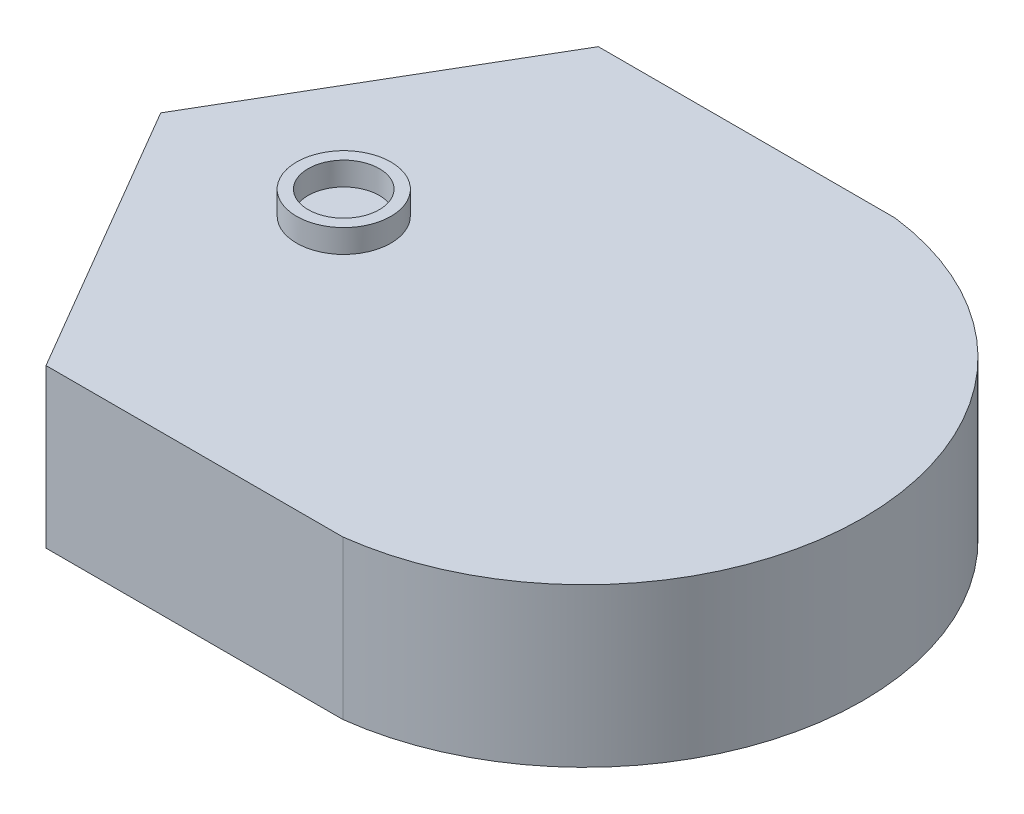
ISO-10303-21;
HEADER;
FILE_DESCRIPTION(('STEP AP214'),'2;1');
FILE_NAME('part.step','',(''),(''),'','','');
FILE_SCHEMA(('AUTOMOTIVE_DESIGN { 1 0 10303 214 1 1 1 1 }'));
ENDSEC;
DATA;
#1=APPLICATION_CONTEXT('core data for automotive mechanical design processes');
#2=APPLICATION_PROTOCOL_DEFINITION('international standard','automotive_design',2000,#1);
#3=PRODUCT_CONTEXT('',#1,'mechanical');
#4=PRODUCT('Part','Part','',(#3));
#5=PRODUCT_RELATED_PRODUCT_CATEGORY('part','',(#4));
#6=PRODUCT_DEFINITION_FORMATION('','',#4);
#7=PRODUCT_DEFINITION_CONTEXT('part definition',#1,'design');
#8=PRODUCT_DEFINITION('design','',#6,#7);
#9=PRODUCT_DEFINITION_SHAPE('','',#8);
#10=(LENGTH_UNIT() NAMED_UNIT(*) SI_UNIT(.MILLI.,.METRE.));
#11=(NAMED_UNIT(*) PLANE_ANGLE_UNIT() SI_UNIT($,.RADIAN.));
#12=(NAMED_UNIT(*) SI_UNIT($,.STERADIAN.) SOLID_ANGLE_UNIT());
#13=UNCERTAINTY_MEASURE_WITH_UNIT(LENGTH_MEASURE(1.E-05),#10,'distance_accuracy_value','');
#14=(GEOMETRIC_REPRESENTATION_CONTEXT(3) GLOBAL_UNCERTAINTY_ASSIGNED_CONTEXT((#13)) GLOBAL_UNIT_ASSIGNED_CONTEXT((#10,
#11,#12)) REPRESENTATION_CONTEXT('',''));
#15=CARTESIAN_POINT('',(0.,0.,0.));
#16=DIRECTION('',(0.,0.,1.));
#17=DIRECTION('',(1.,0.,0.));
#18=AXIS2_PLACEMENT_3D('',#15,#16,#17);
#19=CARTESIAN_POINT('',(21.1852030443668,-6.99999999999999,-3.31454578179853));
#20=DIRECTION('',(0.,1.,0.));
#21=DIRECTION('',(0.,0.,1.));
#22=AXIS2_PLACEMENT_3D('',#19,#20,#21);
#23=CYLINDRICAL_SURFACE('',#22,29.9186118428369);
#24=CARTESIAN_POINT('',(21.1852030443668,10.,-3.31454578179853));
#25=DIRECTION('',(0.,1.,0.));
#26=DIRECTION('',(0.,0.,-1.));
#27=AXIS2_PLACEMENT_3D('',#24,#25,#26);
#28=CIRCLE('',#27,29.9186118428369);
#29=CARTESIAN_POINT('',(24.8996786942298,10.,26.3725895675227));
#30=VERTEX_POINT('',#29);
#31=CARTESIAN_POINT('',(24.8996786942298,10.,-33.0016811311198));
#32=VERTEX_POINT('',#31);
#33=EDGE_CURVE('E122',#30,#32,#28,.T.);
#34=ORIENTED_EDGE('',*,*,#33,.F.);
#35=DIRECTION('',(0.,1.,0.));
#36=VECTOR('',#35,1.);
#37=CARTESIAN_POINT('',(24.8996786942298,-6.99999999999999,26.3725895675227));
#38=LINE('',#37,#36);
#39=CARTESIAN_POINT('',(24.8996786942298,-6.99999999999999,26.3725895675227));
#40=VERTEX_POINT('',#39);
#41=EDGE_CURVE('E59',#40,#30,#38,.T.);
#42=ORIENTED_EDGE('',*,*,#41,.F.);
#43=CARTESIAN_POINT('',(21.1852030443668,-6.99999999999999,-3.31454578179853));
#44=DIRECTION('',(0.,1.,0.));
#45=DIRECTION('',(0.,0.,-1.));
#46=AXIS2_PLACEMENT_3D('',#43,#44,#45);
#47=CIRCLE('',#46,29.9186118428369);
#48=CARTESIAN_POINT('',(24.8996786942298,-6.99999999999999,-33.0016811311198));
#49=VERTEX_POINT('',#48);
#50=EDGE_CURVE('E117',#40,#49,#47,.T.);
#51=ORIENTED_EDGE('',*,*,#50,.T.);
#52=DIRECTION('',(0.,1.,0.));
#53=VECTOR('',#52,1.);
#54=CARTESIAN_POINT('',(24.8996786942298,-6.99999999999999,-33.0016811311198));
#55=LINE('',#54,#53);
#56=EDGE_CURVE('E91',#49,#32,#55,.T.);
#57=ORIENTED_EDGE('',*,*,#56,.T.);
#58=EDGE_LOOP('',(#34,#42,#51,#57));
#59=FACE_BOUND('',#58,.T.);
#60=ADVANCED_FACE('F40',(#59),#23,.T.);
#61=CARTESIAN_POINT('',(-7.00521100508397,-6.99999999999999,26.3725895675227));
#62=DIRECTION('',(0.,0.,1.));
#63=DIRECTION('',(1.,0.,0.));
#64=AXIS2_PLACEMENT_3D('',#61,#62,#63);
#65=PLANE('',#64);
#66=DIRECTION('',(1.,0.,0.));
#67=VECTOR('',#66,1.);
#68=CARTESIAN_POINT('',(-7.00521100508397,10.,26.3725895675227));
#69=LINE('',#68,#67);
#70=CARTESIAN_POINT('',(-7.00521100508397,10.,26.3725895675227));
#71=VERTEX_POINT('',#70);
#72=EDGE_CURVE('E131',#71,#30,#69,.T.);
#73=ORIENTED_EDGE('',*,*,#72,.F.);
#74=DIRECTION('',(0.,1.,0.));
#75=VECTOR('',#74,1.);
#76=CARTESIAN_POINT('',(-7.00521100508397,-6.99999999999999,26.3725895675227));
#77=LINE('',#76,#75);
#78=CARTESIAN_POINT('',(-7.00521100508397,-6.99999999999999,26.3725895675227));
#79=VERTEX_POINT('',#78);
#80=EDGE_CURVE('E79',#79,#71,#77,.T.);
#81=ORIENTED_EDGE('',*,*,#80,.F.);
#82=DIRECTION('',(1.,0.,0.));
#83=VECTOR('',#82,1.);
#84=CARTESIAN_POINT('',(-7.00521100508397,-6.99999999999999,26.3725895675227));
#85=LINE('',#84,#83);
#86=EDGE_CURVE('E112',#79,#40,#85,.T.);
#87=ORIENTED_EDGE('',*,*,#86,.T.);
#88=ORIENTED_EDGE('',*,*,#41,.T.);
#89=EDGE_LOOP('',(#73,#81,#87,#88));
#90=FACE_BOUND('',#89,.T.);
#91=ADVANCED_FACE('F165',(#90),#65,.T.);
#92=CARTESIAN_POINT('',(-24.3617269505939,-6.99999999999999,-3.31454578179853));
#93=DIRECTION('',(-0.863284632008278,0.,0.504717390366462));
#94=DIRECTION('',(0.504717390366462,0.,0.863284632008278));
#95=AXIS2_PLACEMENT_3D('',#92,#93,#94);
#96=PLANE('',#95);
#97=DIRECTION('',(0.504717390366462,0.,0.863284632008279));
#98=VECTOR('',#97,1.);
#99=CARTESIAN_POINT('',(-24.3617269505939,10.,-3.31454578179853));
#100=LINE('',#99,#98);
#101=CARTESIAN_POINT('',(-24.3617269505939,10.,-3.31454578179853));
#102=VERTEX_POINT('',#101);
#103=EDGE_CURVE('E101',#102,#71,#100,.T.);
#104=ORIENTED_EDGE('',*,*,#103,.F.);
#105=DIRECTION('',(0.,1.,0.));
#106=VECTOR('',#105,1.);
#107=CARTESIAN_POINT('',(-24.3617269505939,-6.99999999999999,-3.31454578179853));
#108=LINE('',#107,#106);
#109=CARTESIAN_POINT('',(-24.3617269505939,-6.99999999999999,-3.31454578179853));
#110=VERTEX_POINT('',#109);
#111=EDGE_CURVE('E96',#110,#102,#108,.T.);
#112=ORIENTED_EDGE('',*,*,#111,.F.);
#113=DIRECTION('',(0.504717390366462,0.,0.863284632008279));
#114=VECTOR('',#113,1.);
#115=CARTESIAN_POINT('',(-24.3617269505939,-6.99999999999999,-3.31454578179853));
#116=LINE('',#115,#114);
#117=EDGE_CURVE('E99',#110,#79,#116,.T.);
#118=ORIENTED_EDGE('',*,*,#117,.T.);
#119=ORIENTED_EDGE('',*,*,#80,.T.);
#120=EDGE_LOOP('',(#104,#112,#118,#119));
#121=FACE_BOUND('',#120,.T.);
#122=ADVANCED_FACE('F98',(#121),#96,.T.);
#123=CARTESIAN_POINT('',(-24.3617269505939,-6.99999999999999,-3.31454578179853));
#124=DIRECTION('',(-0.863284632008278,0.,-0.504717390366462));
#125=DIRECTION('',(-0.504717390366462,0.,0.863284632008278));
#126=AXIS2_PLACEMENT_3D('',#123,#124,#125);
#127=PLANE('',#126);
#128=DIRECTION('',(-0.504717390366462,0.,0.863284632008279));
#129=VECTOR('',#128,1.);
#130=CARTESIAN_POINT('',(-24.3617269505939,10.,-3.31454578179853));
#131=LINE('',#130,#129);
#132=CARTESIAN_POINT('',(-7.00521100508397,10.,-33.0016811311198));
#133=VERTEX_POINT('',#132);
#134=EDGE_CURVE('E128',#133,#102,#131,.T.);
#135=ORIENTED_EDGE('',*,*,#134,.F.);
#136=DIRECTION('',(0.,1.,0.));
#137=VECTOR('',#136,1.);
#138=CARTESIAN_POINT('',(-7.00521100508397,-6.99999999999999,-33.0016811311198));
#139=LINE('',#138,#137);
#140=CARTESIAN_POINT('',(-7.00521100508397,-6.99999999999999,-33.0016811311198));
#141=VERTEX_POINT('',#140);
#142=EDGE_CURVE('E106',#141,#133,#139,.T.);
#143=ORIENTED_EDGE('',*,*,#142,.F.);
#144=DIRECTION('',(-0.504717390366462,0.,0.863284632008279));
#145=VECTOR('',#144,1.);
#146=CARTESIAN_POINT('',(-24.3617269505939,-6.99999999999999,-3.31454578179853));
#147=LINE('',#146,#145);
#148=EDGE_CURVE('E111',#141,#110,#147,.T.);
#149=ORIENTED_EDGE('',*,*,#148,.T.);
#150=ORIENTED_EDGE('',*,*,#111,.T.);
#151=EDGE_LOOP('',(#135,#143,#149,#150));
#152=FACE_BOUND('',#151,.T.);
#153=ADVANCED_FACE('F114',(#152),#127,.T.);
#154=CARTESIAN_POINT('',(-7.00521100508397,-6.99999999999999,-33.0016811311198));
#155=DIRECTION('',(0.,0.,-1.));
#156=DIRECTION('',(-1.,0.,0.));
#157=AXIS2_PLACEMENT_3D('',#154,#155,#156);
#158=PLANE('',#157);
#159=DIRECTION('',(-1.,0.,0.));
#160=VECTOR('',#159,1.);
#161=CARTESIAN_POINT('',(-7.00521100508397,10.,-33.0016811311198));
#162=LINE('',#161,#160);
#163=EDGE_CURVE('E125',#32,#133,#162,.T.);
#164=ORIENTED_EDGE('',*,*,#163,.F.);
#165=ORIENTED_EDGE('',*,*,#56,.F.);
#166=DIRECTION('',(-1.,0.,0.));
#167=VECTOR('',#166,1.);
#168=CARTESIAN_POINT('',(-7.00521100508397,-6.99999999999999,-33.0016811311198));
#169=LINE('',#168,#167);
#170=EDGE_CURVE('E115',#49,#141,#169,.T.);
#171=ORIENTED_EDGE('',*,*,#170,.T.);
#172=ORIENTED_EDGE('',*,*,#142,.T.);
#173=EDGE_LOOP('',(#164,#165,#171,#172));
#174=FACE_BOUND('',#173,.T.);
#175=ADVANCED_FACE('F162',(#174),#158,.T.);
#176=CARTESIAN_POINT('',(21.1852030443668,-6.99999999999999,-3.31454578179853));
#177=DIRECTION('',(0.,-1.,0.));
#178=DIRECTION('',(0.,0.,-1.));
#179=AXIS2_PLACEMENT_3D('',#176,#177,#178);
#180=PLANE('',#179);
#181=ORIENTED_EDGE('',*,*,#50,.F.);
#182=ORIENTED_EDGE('',*,*,#86,.F.);
#183=ORIENTED_EDGE('',*,*,#117,.F.);
#184=ORIENTED_EDGE('',*,*,#148,.F.);
#185=ORIENTED_EDGE('',*,*,#170,.F.);
#186=EDGE_LOOP('',(#181,#182,#183,#184,#185));
#187=FACE_BOUND('',#186,.T.);
#188=ADVANCED_FACE('F110',(#187),#180,.T.);
#189=CARTESIAN_POINT('',(0.,10.,0.));
#190=DIRECTION('',(0.,1.,0.));
#191=DIRECTION('',(0.,0.,1.));
#192=AXIS2_PLACEMENT_3D('',#189,#190,#191);
#193=PLANE('',#192);
#194=ORIENTED_EDGE('',*,*,#33,.T.);
#195=ORIENTED_EDGE('',*,*,#163,.T.);
#196=ORIENTED_EDGE('',*,*,#134,.T.);
#197=ORIENTED_EDGE('',*,*,#103,.T.);
#198=ORIENTED_EDGE('',*,*,#72,.T.);
#199=EDGE_LOOP('',(#194,#195,#196,#197,#198));
#200=FACE_BOUND('',#199,.T.);
#201=CARTESIAN_POINT('',(-4.92307692307692,10.,-3.5526923076923));
#202=DIRECTION('',(0.,-1.,0.));
#203=DIRECTION('',(0.,0.,-1.));
#204=AXIS2_PLACEMENT_3D('',#201,#202,#203);
#205=CIRCLE('',#204,5.06563960756712);
#206=CARTESIAN_POINT('',(-4.92307692307692,10.,-8.61833191525942));
#207=VERTEX_POINT('',#206);
#208=EDGE_CURVE('E50',#207,#207,#205,.T.);
#209=ORIENTED_EDGE('',*,*,#208,.T.);
#210=EDGE_LOOP('',(#209));
#211=FACE_BOUND('',#210,.T.);
#212=ADVANCED_FACE('F42',(#200,#211),#193,.T.);
#213=CARTESIAN_POINT('',(-4.92307692307692,0.5,-3.5526923076923));
#214=DIRECTION('',(0.,1.,0.));
#215=DIRECTION('',(0.,0.,1.));
#216=AXIS2_PLACEMENT_3D('',#213,#214,#215);
#217=CYLINDRICAL_SURFACE('',#216,3.825);
#218=CARTESIAN_POINT('',(-4.92307692307692,12.5,-3.5526923076923));
#219=DIRECTION('',(0.,1.,0.));
#220=DIRECTION('',(0.,0.,1.));
#221=AXIS2_PLACEMENT_3D('',#218,#219,#220);
#222=CIRCLE('',#221,3.825);
#223=CARTESIAN_POINT('',(-4.92307692307692,12.5,0.272307692307698));
#224=VERTEX_POINT('',#223);
#225=EDGE_CURVE('E135',#224,#224,#222,.T.);
#226=ORIENTED_EDGE('',*,*,#225,.T.);
#227=EDGE_LOOP('',(#226));
#228=FACE_BOUND('',#227,.T.);
#229=CARTESIAN_POINT('',(-4.92307692307692,10.,-3.5526923076923));
#230=DIRECTION('',(0.,-1.,0.));
#231=DIRECTION('',(0.,0.,-1.));
#232=AXIS2_PLACEMENT_3D('',#229,#230,#231);
#233=CIRCLE('',#232,3.825);
#234=CARTESIAN_POINT('',(-4.92307692307692,10.,-7.3776923076923));
#235=VERTEX_POINT('',#234);
#236=EDGE_CURVE('E12',#235,#235,#233,.F.);
#237=ORIENTED_EDGE('',*,*,#236,.F.);
#238=EDGE_LOOP('',(#237));
#239=FACE_BOUND('',#238,.T.);
#240=ADVANCED_FACE('F152',(#228,#239),#217,.F.);
#241=CARTESIAN_POINT('',(-4.92307692307692,12.5,-3.5526923076923));
#242=DIRECTION('',(0.,-1.,0.));
#243=DIRECTION('',(0.,0.,-1.));
#244=AXIS2_PLACEMENT_3D('',#241,#242,#243);
#245=CYLINDRICAL_SURFACE('',#244,5.06563960756712);
#246=CARTESIAN_POINT('',(-4.92307692307692,12.5,-3.5526923076923));
#247=DIRECTION('',(0.,1.,0.));
#248=DIRECTION('',(0.,0.,1.));
#249=AXIS2_PLACEMENT_3D('',#246,#247,#248);
#250=CIRCLE('',#249,5.06563960756712);
#251=CARTESIAN_POINT('',(-4.92307692307692,12.5,1.51294729987482));
#252=VERTEX_POINT('',#251);
#253=EDGE_CURVE('E44',#252,#252,#250,.T.);
#254=ORIENTED_EDGE('',*,*,#253,.F.);
#255=EDGE_LOOP('',(#254));
#256=FACE_BOUND('',#255,.T.);
#257=ORIENTED_EDGE('',*,*,#208,.F.);
#258=EDGE_LOOP('',(#257));
#259=FACE_BOUND('',#258,.T.);
#260=ADVANCED_FACE('F149',(#256,#259),#245,.T.);
#261=CARTESIAN_POINT('',(-4.92307692307692,12.5,-3.5526923076923));
#262=DIRECTION('',(0.,1.,0.));
#263=DIRECTION('',(0.,0.,1.));
#264=AXIS2_PLACEMENT_3D('',#261,#262,#263);
#265=PLANE('',#264);
#266=ORIENTED_EDGE('',*,*,#253,.T.);
#267=EDGE_LOOP('',(#266));
#268=FACE_BOUND('',#267,.T.);
#269=ORIENTED_EDGE('',*,*,#225,.F.);
#270=EDGE_LOOP('',(#269));
#271=FACE_BOUND('',#270,.T.);
#272=ADVANCED_FACE('F146',(#268,#271),#265,.T.);
#273=CARTESIAN_POINT('',(21.1852030443668,10.,-3.31454578179853));
#274=DIRECTION('',(0.,-1.,0.));
#275=DIRECTION('',(0.,0.,-1.));
#276=AXIS2_PLACEMENT_3D('',#273,#274,#275);
#277=PLANE('',#276);
#278=ORIENTED_EDGE('',*,*,#236,.T.);
#279=EDGE_LOOP('',(#278));
#280=FACE_BOUND('',#279,.T.);
#281=ADVANCED_FACE('F175',(#280),#277,.F.);
#282=CLOSED_SHELL('',(#60,#91,#122,#153,#175,#188,#212,#240,#260,#272,#281));
#283=MANIFOLD_SOLID_BREP('B2',#282);
#284=ADVANCED_BREP_SHAPE_REPRESENTATION('',(#18,#283),#14);
#285=SHAPE_DEFINITION_REPRESENTATION(#9,#284);
ENDSEC;
END-ISO-10303-21;
